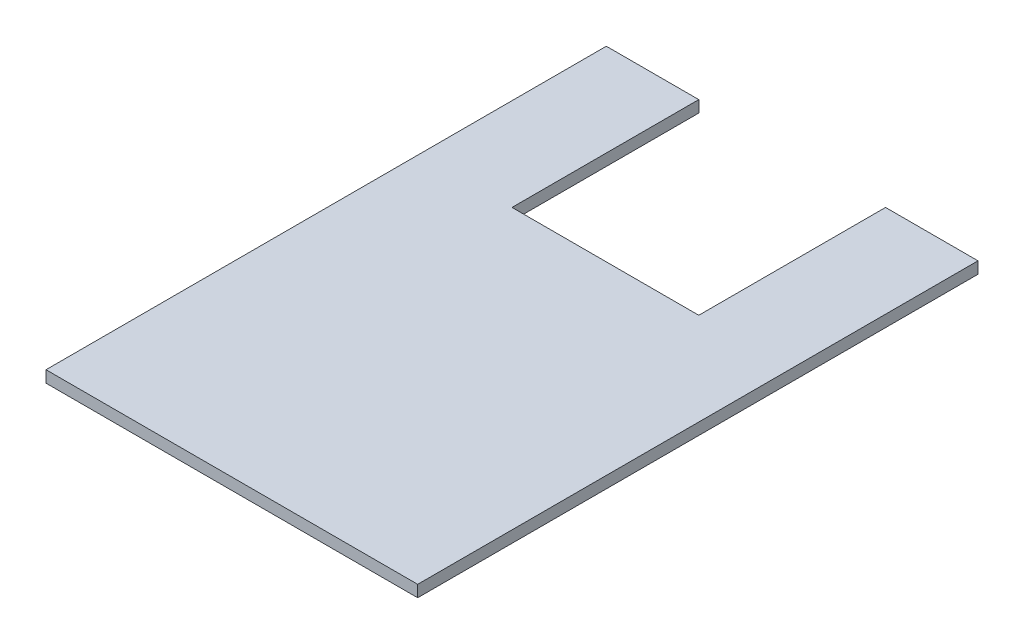
ISO-10303-21;
HEADER;
FILE_DESCRIPTION(('STEP AP214'),'2;1');
FILE_NAME('part.step','',(''),(''),'','','');
FILE_SCHEMA(('AUTOMOTIVE_DESIGN { 1 0 10303 214 1 1 1 1 }'));
ENDSEC;
DATA;
#1=APPLICATION_CONTEXT('core data for automotive mechanical design processes');
#2=APPLICATION_PROTOCOL_DEFINITION('international standard','automotive_design',2000,#1);
#3=PRODUCT_CONTEXT('',#1,'mechanical');
#4=PRODUCT('Part','Part','',(#3));
#5=PRODUCT_RELATED_PRODUCT_CATEGORY('part','',(#4));
#6=PRODUCT_DEFINITION_FORMATION('','',#4);
#7=PRODUCT_DEFINITION_CONTEXT('part definition',#1,'design');
#8=PRODUCT_DEFINITION('design','',#6,#7);
#9=PRODUCT_DEFINITION_SHAPE('','',#8);
#10=(LENGTH_UNIT() NAMED_UNIT(*) SI_UNIT(.MILLI.,.METRE.));
#11=(NAMED_UNIT(*) PLANE_ANGLE_UNIT() SI_UNIT($,.RADIAN.));
#12=(NAMED_UNIT(*) SI_UNIT($,.STERADIAN.) SOLID_ANGLE_UNIT());
#13=UNCERTAINTY_MEASURE_WITH_UNIT(LENGTH_MEASURE(1.E-05),#10,'distance_accuracy_value','');
#14=(GEOMETRIC_REPRESENTATION_CONTEXT(3) GLOBAL_UNCERTAINTY_ASSIGNED_CONTEXT((#13)) GLOBAL_UNIT_ASSIGNED_CONTEXT((#10,
#11,#12)) REPRESENTATION_CONTEXT('',''));
#15=CARTESIAN_POINT('',(0.,0.,0.));
#16=DIRECTION('',(0.,0.,1.));
#17=DIRECTION('',(1.,0.,0.));
#18=AXIS2_PLACEMENT_3D('',#15,#16,#17);
#19=CARTESIAN_POINT('',(0.,0.,0.));
#20=DIRECTION('',(0.,0.,-1.));
#21=DIRECTION('',(-1.,0.,0.));
#22=AXIS2_PLACEMENT_3D('',#19,#20,#21);
#23=PLANE('',#22);
#24=DIRECTION('',(0.,-1.,0.));
#25=VECTOR('',#24,1.);
#26=CARTESIAN_POINT('',(-25.4,-17.8848333333333,0.));
#27=LINE('',#26,#25);
#28=CARTESIAN_POINT('',(-25.4,-17.8858333333333,0.));
#29=VERTEX_POINT('',#28);
#30=CARTESIAN_POINT('',(-25.4,-21.0608333333333,0.));
#31=VERTEX_POINT('',#30);
#32=EDGE_CURVE('E113',#29,#31,#27,.T.);
#33=ORIENTED_EDGE('',*,*,#32,.T.);
#34=DIRECTION('',(1.,0.,0.));
#35=VECTOR('',#34,1.);
#36=CARTESIAN_POINT('',(-50.546,-21.0608333333333,0.));
#37=LINE('',#36,#35);
#38=CARTESIAN_POINT('',(-50.546,-21.0608333333333,0.));
#39=VERTEX_POINT('',#38);
#40=EDGE_CURVE('E141',#39,#31,#37,.T.);
#41=ORIENTED_EDGE('',*,*,#40,.F.);
#42=DIRECTION('',(0.,-1.,0.));
#43=VECTOR('',#42,1.);
#44=CARTESIAN_POINT('',(-50.546,-21.0608333333333,0.));
#45=LINE('',#44,#43);
#46=CARTESIAN_POINT('',(-50.546,-17.8858333333333,0.));
#47=VERTEX_POINT('',#46);
#48=EDGE_CURVE('E132',#47,#39,#45,.T.);
#49=ORIENTED_EDGE('',*,*,#48,.F.);
#50=DIRECTION('',(-1.,0.,0.));
#51=VECTOR('',#50,1.);
#52=CARTESIAN_POINT('',(-50.546,-17.8858333333333,0.));
#53=LINE('',#52,#51);
#54=EDGE_CURVE('E84',#29,#47,#53,.T.);
#55=ORIENTED_EDGE('',*,*,#54,.F.);
#56=EDGE_LOOP('',(#33,#41,#49,#55));
#57=FACE_BOUND('',#56,.T.);
#58=ADVANCED_FACE('F38',(#57),#23,.T.);
#59=CARTESIAN_POINT('',(-50.546,-21.0608333333333,152.4));
#60=DIRECTION('',(1.,0.,0.));
#61=DIRECTION('',(0.,0.,-1.));
#62=AXIS2_PLACEMENT_3D('',#59,#60,#61);
#63=PLANE('',#62);
#64=ORIENTED_EDGE('',*,*,#48,.T.);
#65=DIRECTION('',(0.,0.,-1.));
#66=VECTOR('',#65,1.);
#67=CARTESIAN_POINT('',(-50.546,-21.0608333333333,152.4));
#68=LINE('',#67,#66);
#69=CARTESIAN_POINT('',(-50.546,-21.0608333333333,152.4));
#70=VERTEX_POINT('',#69);
#71=EDGE_CURVE('E11',#70,#39,#68,.T.);
#72=ORIENTED_EDGE('',*,*,#71,.F.);
#73=DIRECTION('',(0.,-1.,0.));
#74=VECTOR('',#73,1.);
#75=CARTESIAN_POINT('',(-50.546,-21.0608333333333,152.4));
#76=LINE('',#75,#74);
#77=CARTESIAN_POINT('',(-50.546,-17.8858333333333,152.4));
#78=VERTEX_POINT('',#77);
#79=EDGE_CURVE('E140',#78,#70,#76,.T.);
#80=ORIENTED_EDGE('',*,*,#79,.F.);
#81=DIRECTION('',(0.,0.,-1.));
#82=VECTOR('',#81,1.);
#83=CARTESIAN_POINT('',(-50.546,-17.8858333333333,152.4));
#84=LINE('',#83,#82);
#85=EDGE_CURVE('E145',#78,#47,#84,.T.);
#86=ORIENTED_EDGE('',*,*,#85,.T.);
#87=EDGE_LOOP('',(#64,#72,#80,#86));
#88=FACE_BOUND('',#87,.T.);
#89=ADVANCED_FACE('F40',(#88),#63,.F.);
#90=CARTESIAN_POINT('',(-50.546,-21.0608333333333,152.4));
#91=DIRECTION('',(0.,1.,0.));
#92=DIRECTION('',(0.,0.,1.));
#93=AXIS2_PLACEMENT_3D('',#90,#91,#92);
#94=PLANE('',#93);
#95=ORIENTED_EDGE('',*,*,#40,.T.);
#96=DIRECTION('',(0.,0.,-1.));
#97=VECTOR('',#96,1.);
#98=CARTESIAN_POINT('',(-25.4,-21.0608333333333,0.));
#99=LINE('',#98,#97);
#100=CARTESIAN_POINT('',(-25.4,-21.0608333333333,50.8));
#101=VERTEX_POINT('',#100);
#102=EDGE_CURVE('E118',#101,#31,#99,.T.);
#103=ORIENTED_EDGE('',*,*,#102,.F.);
#104=DIRECTION('',(-1.,0.,0.));
#105=VECTOR('',#104,1.);
#106=CARTESIAN_POINT('',(-25.4,-21.0608333333333,50.8));
#107=LINE('',#106,#105);
#108=CARTESIAN_POINT('',(25.4,-21.0608333333333,50.8));
#109=VERTEX_POINT('',#108);
#110=EDGE_CURVE('E123',#109,#101,#107,.T.);
#111=ORIENTED_EDGE('',*,*,#110,.F.);
#112=DIRECTION('',(0.,0.,1.));
#113=VECTOR('',#112,1.);
#114=CARTESIAN_POINT('',(25.4,-21.0608333333333,0.));
#115=LINE('',#114,#113);
#116=CARTESIAN_POINT('',(25.4,-21.0608333333333,0.));
#117=VERTEX_POINT('',#116);
#118=EDGE_CURVE('E179',#117,#109,#115,.T.);
#119=ORIENTED_EDGE('',*,*,#118,.F.);
#120=CARTESIAN_POINT('',(50.546,-21.0608333333333,0.));
#121=VERTEX_POINT('',#120);
#122=EDGE_CURVE('E163',#117,#121,#37,.T.);
#123=ORIENTED_EDGE('',*,*,#122,.T.);
#124=DIRECTION('',(0.,0.,-1.));
#125=VECTOR('',#124,1.);
#126=CARTESIAN_POINT('',(50.546,-21.0608333333333,152.4));
#127=LINE('',#126,#125);
#128=CARTESIAN_POINT('',(50.546,-21.0608333333333,152.4));
#129=VERTEX_POINT('',#128);
#130=EDGE_CURVE('E47',#129,#121,#127,.T.);
#131=ORIENTED_EDGE('',*,*,#130,.F.);
#132=DIRECTION('',(1.,0.,0.));
#133=VECTOR('',#132,1.);
#134=CARTESIAN_POINT('',(-50.546,-21.0608333333333,152.4));
#135=LINE('',#134,#133);
#136=EDGE_CURVE('E91',#70,#129,#135,.T.);
#137=ORIENTED_EDGE('',*,*,#136,.F.);
#138=ORIENTED_EDGE('',*,*,#71,.T.);
#139=EDGE_LOOP('',(#95,#103,#111,#119,#123,#131,#137,#138));
#140=FACE_BOUND('',#139,.T.);
#141=ADVANCED_FACE('F176',(#140),#94,.F.);
#142=CARTESIAN_POINT('',(50.546,-21.0608333333333,152.4));
#143=DIRECTION('',(-1.,0.,0.));
#144=DIRECTION('',(0.,0.,1.));
#145=AXIS2_PLACEMENT_3D('',#142,#143,#144);
#146=PLANE('',#145);
#147=DIRECTION('',(0.,1.,0.));
#148=VECTOR('',#147,1.);
#149=CARTESIAN_POINT('',(50.546,-21.0608333333333,0.));
#150=LINE('',#149,#148);
#151=CARTESIAN_POINT('',(50.546,-17.8858333333333,0.));
#152=VERTEX_POINT('',#151);
#153=EDGE_CURVE('E135',#121,#152,#150,.T.);
#154=ORIENTED_EDGE('',*,*,#153,.T.);
#155=DIRECTION('',(0.,0.,-1.));
#156=VECTOR('',#155,1.);
#157=CARTESIAN_POINT('',(50.546,-17.8858333333333,152.4));
#158=LINE('',#157,#156);
#159=CARTESIAN_POINT('',(50.546,-17.8858333333333,152.4));
#160=VERTEX_POINT('',#159);
#161=EDGE_CURVE('E148',#160,#152,#158,.T.);
#162=ORIENTED_EDGE('',*,*,#161,.F.);
#163=DIRECTION('',(0.,1.,0.));
#164=VECTOR('',#163,1.);
#165=CARTESIAN_POINT('',(50.546,-21.0608333333333,152.4));
#166=LINE('',#165,#164);
#167=EDGE_CURVE('E158',#129,#160,#166,.T.);
#168=ORIENTED_EDGE('',*,*,#167,.F.);
#169=ORIENTED_EDGE('',*,*,#130,.T.);
#170=EDGE_LOOP('',(#154,#162,#168,#169));
#171=FACE_BOUND('',#170,.T.);
#172=ADVANCED_FACE('F156',(#171),#146,.F.);
#173=CARTESIAN_POINT('',(-50.546,-17.8858333333333,152.4));
#174=DIRECTION('',(0.,-1.,0.));
#175=DIRECTION('',(0.,0.,-1.));
#176=AXIS2_PLACEMENT_3D('',#173,#174,#175);
#177=PLANE('',#176);
#178=DIRECTION('',(1.,0.,0.));
#179=VECTOR('',#178,1.);
#180=CARTESIAN_POINT('',(-25.4,-17.8858333333333,50.8));
#181=LINE('',#180,#179);
#182=CARTESIAN_POINT('',(-25.4,-17.8858333333333,50.8));
#183=VERTEX_POINT('',#182);
#184=CARTESIAN_POINT('',(25.4,-17.8858333333333,50.8));
#185=VERTEX_POINT('',#184);
#186=EDGE_CURVE('E127',#183,#185,#181,.T.);
#187=ORIENTED_EDGE('',*,*,#186,.F.);
#188=DIRECTION('',(0.,0.,1.));
#189=VECTOR('',#188,1.);
#190=CARTESIAN_POINT('',(-25.4,-17.8858333333333,0.));
#191=LINE('',#190,#189);
#192=EDGE_CURVE('E115',#29,#183,#191,.T.);
#193=ORIENTED_EDGE('',*,*,#192,.F.);
#194=ORIENTED_EDGE('',*,*,#54,.T.);
#195=ORIENTED_EDGE('',*,*,#85,.F.);
#196=DIRECTION('',(-1.,0.,0.));
#197=VECTOR('',#196,1.);
#198=CARTESIAN_POINT('',(-50.546,-17.8858333333333,152.4));
#199=LINE('',#198,#197);
#200=EDGE_CURVE('E63',#160,#78,#199,.T.);
#201=ORIENTED_EDGE('',*,*,#200,.F.);
#202=ORIENTED_EDGE('',*,*,#161,.T.);
#203=CARTESIAN_POINT('',(25.4,-17.8858333333333,0.));
#204=VERTEX_POINT('',#203);
#205=EDGE_CURVE('E134',#152,#204,#53,.T.);
#206=ORIENTED_EDGE('',*,*,#205,.T.);
#207=DIRECTION('',(0.,0.,-1.));
#208=VECTOR('',#207,1.);
#209=CARTESIAN_POINT('',(25.4,-17.8858333333333,0.));
#210=LINE('',#209,#208);
#211=EDGE_CURVE('E54',#185,#204,#210,.T.);
#212=ORIENTED_EDGE('',*,*,#211,.F.);
#213=EDGE_LOOP('',(#187,#193,#194,#195,#201,#202,#206,#212));
#214=FACE_BOUND('',#213,.T.);
#215=ADVANCED_FACE('F125',(#214),#177,.F.);
#216=CARTESIAN_POINT('',(0.,0.,152.4));
#217=DIRECTION('',(0.,0.,-1.));
#218=DIRECTION('',(-1.,0.,0.));
#219=AXIS2_PLACEMENT_3D('',#216,#217,#218);
#220=PLANE('',#219);
#221=ORIENTED_EDGE('',*,*,#79,.T.);
#222=ORIENTED_EDGE('',*,*,#136,.T.);
#223=ORIENTED_EDGE('',*,*,#167,.T.);
#224=ORIENTED_EDGE('',*,*,#200,.T.);
#225=EDGE_LOOP('',(#221,#222,#223,#224));
#226=FACE_BOUND('',#225,.T.);
#227=ADVANCED_FACE('F197',(#226),#220,.F.);
#228=DIRECTION('',(0.,-1.,0.));
#229=VECTOR('',#228,1.);
#230=CARTESIAN_POINT('',(25.4,-17.8848333333333,0.));
#231=LINE('',#230,#229);
#232=EDGE_CURVE('E122',#204,#117,#231,.T.);
#233=ORIENTED_EDGE('',*,*,#232,.F.);
#234=ORIENTED_EDGE('',*,*,#205,.F.);
#235=ORIENTED_EDGE('',*,*,#153,.F.);
#236=ORIENTED_EDGE('',*,*,#122,.F.);
#237=EDGE_LOOP('',(#233,#234,#235,#236));
#238=FACE_BOUND('',#237,.T.);
#239=ADVANCED_FACE('F162',(#238),#23,.T.);
#240=CARTESIAN_POINT('',(-25.4,-17.8848333333333,0.));
#241=DIRECTION('',(-1.,0.,0.));
#242=DIRECTION('',(0.,0.,1.));
#243=AXIS2_PLACEMENT_3D('',#240,#241,#242);
#244=PLANE('',#243);
#245=ORIENTED_EDGE('',*,*,#192,.T.);
#246=DIRECTION('',(0.,-1.,0.));
#247=VECTOR('',#246,1.);
#248=CARTESIAN_POINT('',(-25.4,-17.8848333333333,50.8));
#249=LINE('',#248,#247);
#250=EDGE_CURVE('E172',#183,#101,#249,.T.);
#251=ORIENTED_EDGE('',*,*,#250,.T.);
#252=ORIENTED_EDGE('',*,*,#102,.T.);
#253=ORIENTED_EDGE('',*,*,#32,.F.);
#254=EDGE_LOOP('',(#245,#251,#252,#253));
#255=FACE_BOUND('',#254,.T.);
#256=ADVANCED_FACE('F114',(#255),#244,.F.);
#257=CARTESIAN_POINT('',(-25.4,-17.8848333333333,50.8));
#258=DIRECTION('',(0.,0.,1.));
#259=DIRECTION('',(1.,0.,0.));
#260=AXIS2_PLACEMENT_3D('',#257,#258,#259);
#261=PLANE('',#260);
#262=ORIENTED_EDGE('',*,*,#186,.T.);
#263=DIRECTION('',(0.,-1.,0.));
#264=VECTOR('',#263,1.);
#265=CARTESIAN_POINT('',(25.4,-17.8848333333333,50.8));
#266=LINE('',#265,#264);
#267=EDGE_CURVE('E190',#185,#109,#266,.T.);
#268=ORIENTED_EDGE('',*,*,#267,.T.);
#269=ORIENTED_EDGE('',*,*,#110,.T.);
#270=ORIENTED_EDGE('',*,*,#250,.F.);
#271=EDGE_LOOP('',(#262,#268,#269,#270));
#272=FACE_BOUND('',#271,.T.);
#273=ADVANCED_FACE('F215',(#272),#261,.F.);
#274=CARTESIAN_POINT('',(25.4,-17.8848333333333,0.));
#275=DIRECTION('',(1.,0.,0.));
#276=DIRECTION('',(0.,0.,-1.));
#277=AXIS2_PLACEMENT_3D('',#274,#275,#276);
#278=PLANE('',#277);
#279=ORIENTED_EDGE('',*,*,#211,.T.);
#280=ORIENTED_EDGE('',*,*,#232,.T.);
#281=ORIENTED_EDGE('',*,*,#118,.T.);
#282=ORIENTED_EDGE('',*,*,#267,.F.);
#283=EDGE_LOOP('',(#279,#280,#281,#282));
#284=FACE_BOUND('',#283,.T.);
#285=ADVANCED_FACE('F221',(#284),#278,.F.);
#286=CLOSED_SHELL('',(#58,#89,#141,#172,#215,#227,#239,#256,#273,#285));
#287=MANIFOLD_SOLID_BREP('B2',#286);
#288=ADVANCED_BREP_SHAPE_REPRESENTATION('',(#18,#287),#14);
#289=SHAPE_DEFINITION_REPRESENTATION(#9,#288);
ENDSEC;
END-ISO-10303-21;
